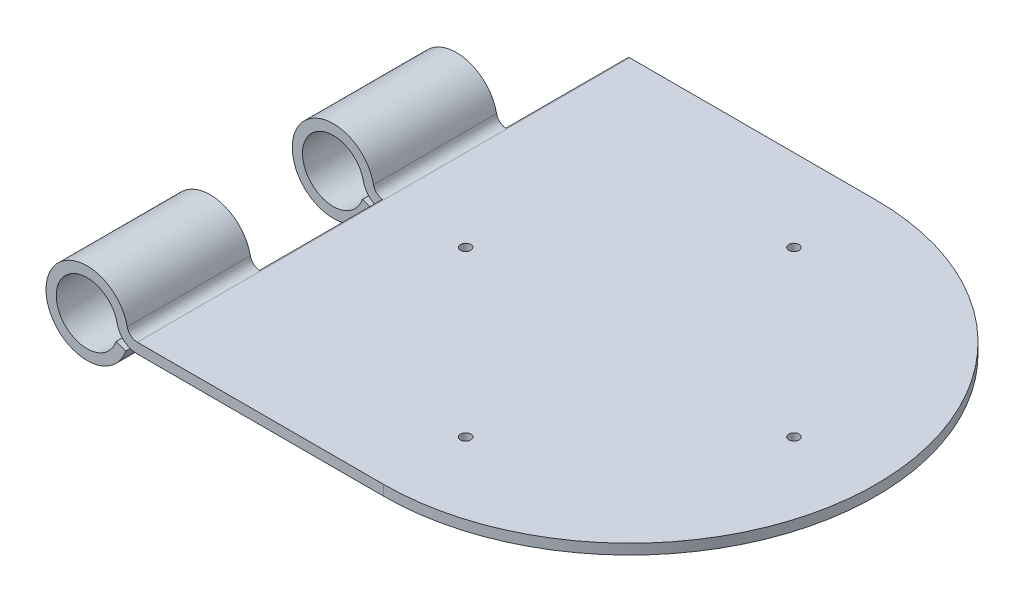
ISO-10303-21;
HEADER;
FILE_DESCRIPTION(('STEP AP214'),'2;1');
FILE_NAME('part.step','',(''),(''),'','','');
FILE_SCHEMA(('AUTOMOTIVE_DESIGN { 1 0 10303 214 1 1 1 1 }'));
ENDSEC;
DATA;
#1=APPLICATION_CONTEXT('core data for automotive mechanical design processes');
#2=APPLICATION_PROTOCOL_DEFINITION('international standard','automotive_design',2000,#1);
#3=PRODUCT_CONTEXT('',#1,'mechanical');
#4=PRODUCT('Part','Part','',(#3));
#5=PRODUCT_RELATED_PRODUCT_CATEGORY('part','',(#4));
#6=PRODUCT_DEFINITION_FORMATION('','',#4);
#7=PRODUCT_DEFINITION_CONTEXT('part definition',#1,'design');
#8=PRODUCT_DEFINITION('design','',#6,#7);
#9=PRODUCT_DEFINITION_SHAPE('','',#8);
#10=(LENGTH_UNIT() NAMED_UNIT(*) SI_UNIT(.MILLI.,.METRE.));
#11=(NAMED_UNIT(*) PLANE_ANGLE_UNIT() SI_UNIT($,.RADIAN.));
#12=(NAMED_UNIT(*) SI_UNIT($,.STERADIAN.) SOLID_ANGLE_UNIT());
#13=UNCERTAINTY_MEASURE_WITH_UNIT(LENGTH_MEASURE(1.E-05),#10,'distance_accuracy_value','');
#14=(GEOMETRIC_REPRESENTATION_CONTEXT(3) GLOBAL_UNCERTAINTY_ASSIGNED_CONTEXT((#13)) GLOBAL_UNIT_ASSIGNED_CONTEXT((#10,
#11,#12)) REPRESENTATION_CONTEXT('',''));
#15=CARTESIAN_POINT('',(0.,0.,0.));
#16=DIRECTION('',(0.,0.,1.));
#17=DIRECTION('',(1.,0.,0.));
#18=AXIS2_PLACEMENT_3D('',#15,#16,#17);
#19=CARTESIAN_POINT('',(0.,-1.5875,76.2));
#20=DIRECTION('',(0.,1.,0.));
#21=DIRECTION('',(0.,0.,1.));
#22=AXIS2_PLACEMENT_3D('',#19,#20,#21);
#23=PLANE('',#22);
#24=CARTESIAN_POINT('',(71.2771299333366,-1.5875,38.1));
#25=DIRECTION('',(0.,-1.,0.));
#26=DIRECTION('',(0.,0.,-1.));
#27=AXIS2_PLACEMENT_3D('',#24,#25,#26);
#28=CIRCLE('',#27,0.793749999999993);
#29=CARTESIAN_POINT('',(71.2771299333366,-1.5875,37.30625));
#30=VERTEX_POINT('',#29);
#31=EDGE_CURVE('E333',#30,#30,#28,.F.);
#32=ORIENTED_EDGE('',*,*,#31,.T.);
#33=EDGE_LOOP('',(#32));
#34=FACE_BOUND('',#33,.T.);
#35=CARTESIAN_POINT('',(45.8771299333366,-1.5875,63.5));
#36=DIRECTION('',(0.,-1.,0.));
#37=DIRECTION('',(0.,0.,-1.));
#38=AXIS2_PLACEMENT_3D('',#35,#36,#37);
#39=CIRCLE('',#38,0.793749999999993);
#40=CARTESIAN_POINT('',(45.8771299333366,-1.5875,62.70625));
#41=VERTEX_POINT('',#40);
#42=EDGE_CURVE('E327',#41,#41,#39,.F.);
#43=ORIENTED_EDGE('',*,*,#42,.T.);
#44=EDGE_LOOP('',(#43));
#45=FACE_BOUND('',#44,.T.);
#46=CARTESIAN_POINT('',(45.8771299333366,-1.5875,38.1));
#47=DIRECTION('',(0.,-1.,0.));
#48=DIRECTION('',(0.,0.,-1.));
#49=AXIS2_PLACEMENT_3D('',#46,#47,#48);
#50=CIRCLE('',#49,38.1);
#51=CARTESIAN_POINT('',(45.8771299333366,-1.5875,76.2));
#52=VERTEX_POINT('',#51);
#53=CARTESIAN_POINT('',(45.8771299333366,-1.5875,0.));
#54=VERTEX_POINT('',#53);
#55=EDGE_CURVE('E223',#52,#54,#50,.F.);
#56=ORIENTED_EDGE('',*,*,#55,.F.);
#57=DIRECTION('',(1.,0.,0.));
#58=VECTOR('',#57,1.);
#59=CARTESIAN_POINT('',(0.,-1.5875,76.2));
#60=LINE('',#59,#58);
#61=CARTESIAN_POINT('',(7.77712993333659,-1.5875,76.2));
#62=VERTEX_POINT('',#61);
#63=EDGE_CURVE('E227',#62,#52,#60,.T.);
#64=ORIENTED_EDGE('',*,*,#63,.F.);
#65=DIRECTION('',(0.,0.,-1.));
#66=VECTOR('',#65,1.);
#67=CARTESIAN_POINT('',(7.77712993333659,-1.5875,76.2));
#68=LINE('',#67,#66);
#69=CARTESIAN_POINT('',(7.77712993333659,-1.5875,0.));
#70=VERTEX_POINT('',#69);
#71=EDGE_CURVE('E303',#62,#70,#68,.T.);
#72=ORIENTED_EDGE('',*,*,#71,.T.);
#73=DIRECTION('',(1.,0.,0.));
#74=VECTOR('',#73,1.);
#75=CARTESIAN_POINT('',(0.,-1.5875,0.));
#76=LINE('',#75,#74);
#77=EDGE_CURVE('E230',#70,#54,#76,.T.);
#78=ORIENTED_EDGE('',*,*,#77,.T.);
#79=EDGE_LOOP('',(#56,#64,#72,#78));
#80=FACE_BOUND('',#79,.T.);
#81=CARTESIAN_POINT('',(20.4771299333366,-1.5875,38.1));
#82=DIRECTION('',(0.,-1.,0.));
#83=DIRECTION('',(0.,0.,-1.));
#84=AXIS2_PLACEMENT_3D('',#81,#82,#83);
#85=CIRCLE('',#84,0.793749999999999);
#86=CARTESIAN_POINT('',(20.4771299333366,-1.5875,37.30625));
#87=VERTEX_POINT('',#86);
#88=EDGE_CURVE('E330',#87,#87,#85,.F.);
#89=ORIENTED_EDGE('',*,*,#88,.T.);
#90=EDGE_LOOP('',(#89));
#91=FACE_BOUND('',#90,.T.);
#92=CARTESIAN_POINT('',(45.8771299333366,-1.5875,12.7));
#93=DIRECTION('',(0.,-1.,0.));
#94=DIRECTION('',(0.,0.,-1.));
#95=AXIS2_PLACEMENT_3D('',#92,#93,#94);
#96=CIRCLE('',#95,0.79375);
#97=CARTESIAN_POINT('',(45.8771299333366,-1.5875,11.90625));
#98=VERTEX_POINT('',#97);
#99=EDGE_CURVE('E344',#98,#98,#96,.F.);
#100=ORIENTED_EDGE('',*,*,#99,.T.);
#101=EDGE_LOOP('',(#100));
#102=FACE_BOUND('',#101,.T.);
#103=ADVANCED_FACE('F89',(#34,#45,#80,#91,#102),#23,.F.);
#104=CARTESIAN_POINT('',(0.,0.,76.2));
#105=DIRECTION('',(0.,1.,0.));
#106=DIRECTION('',(0.,0.,1.));
#107=AXIS2_PLACEMENT_3D('',#104,#105,#106);
#108=PLANE('',#107);
#109=CARTESIAN_POINT('',(71.2771299333366,0.,38.1));
#110=DIRECTION('',(0.,1.,0.));
#111=DIRECTION('',(0.,0.,1.));
#112=AXIS2_PLACEMENT_3D('',#109,#110,#111);
#113=CIRCLE('',#112,0.793749999999993);
#114=CARTESIAN_POINT('',(71.2771299333366,0.,38.89375));
#115=VERTEX_POINT('',#114);
#116=EDGE_CURVE('E331',#115,#115,#113,.F.);
#117=ORIENTED_EDGE('',*,*,#116,.T.);
#118=EDGE_LOOP('',(#117));
#119=FACE_BOUND('',#118,.T.);
#120=CARTESIAN_POINT('',(45.8771299333366,0.,63.5));
#121=DIRECTION('',(0.,1.,0.));
#122=DIRECTION('',(0.,0.,1.));
#123=AXIS2_PLACEMENT_3D('',#120,#121,#122);
#124=CIRCLE('',#123,0.793749999999993);
#125=CARTESIAN_POINT('',(45.8771299333366,0.,64.29375));
#126=VERTEX_POINT('',#125);
#127=EDGE_CURVE('E232',#126,#126,#124,.F.);
#128=ORIENTED_EDGE('',*,*,#127,.T.);
#129=EDGE_LOOP('',(#128));
#130=FACE_BOUND('',#129,.T.);
#131=DIRECTION('',(1.,0.,0.));
#132=VECTOR('',#131,1.);
#133=CARTESIAN_POINT('',(0.,0.,76.2));
#134=LINE('',#133,#132);
#135=CARTESIAN_POINT('',(7.77712993333659,0.,76.2));
#136=VERTEX_POINT('',#135);
#137=CARTESIAN_POINT('',(45.8771299333366,0.,76.2));
#138=VERTEX_POINT('',#137);
#139=EDGE_CURVE('E243',#136,#138,#134,.T.);
#140=ORIENTED_EDGE('',*,*,#139,.T.);
#141=CARTESIAN_POINT('',(45.8771299333366,0.,38.1));
#142=DIRECTION('',(0.,1.,0.));
#143=DIRECTION('',(0.,0.,1.));
#144=AXIS2_PLACEMENT_3D('',#141,#142,#143);
#145=CIRCLE('',#144,38.1);
#146=CARTESIAN_POINT('',(45.8771299333366,0.,0.));
#147=VERTEX_POINT('',#146);
#148=EDGE_CURVE('E99',#147,#138,#145,.F.);
#149=ORIENTED_EDGE('',*,*,#148,.F.);
#150=DIRECTION('',(1.,0.,0.));
#151=VECTOR('',#150,1.);
#152=CARTESIAN_POINT('',(0.,0.,0.));
#153=LINE('',#152,#151);
#154=CARTESIAN_POINT('',(7.77712993333659,0.,0.));
#155=VERTEX_POINT('',#154);
#156=EDGE_CURVE('E275',#155,#147,#153,.T.);
#157=ORIENTED_EDGE('',*,*,#156,.F.);
#158=DIRECTION('',(0.,0.,-1.));
#159=VECTOR('',#158,1.);
#160=CARTESIAN_POINT('',(7.77712993333659,0.,76.2));
#161=LINE('',#160,#159);
#162=EDGE_CURVE('E299',#136,#155,#161,.T.);
#163=ORIENTED_EDGE('',*,*,#162,.F.);
#164=EDGE_LOOP('',(#140,#149,#157,#163));
#165=FACE_BOUND('',#164,.T.);
#166=CARTESIAN_POINT('',(20.4771299333366,0.,38.1));
#167=DIRECTION('',(0.,1.,0.));
#168=DIRECTION('',(0.,0.,1.));
#169=AXIS2_PLACEMENT_3D('',#166,#167,#168);
#170=CIRCLE('',#169,0.793749999999999);
#171=CARTESIAN_POINT('',(20.4771299333366,0.,38.89375));
#172=VERTEX_POINT('',#171);
#173=EDGE_CURVE('E328',#172,#172,#170,.F.);
#174=ORIENTED_EDGE('',*,*,#173,.T.);
#175=EDGE_LOOP('',(#174));
#176=FACE_BOUND('',#175,.T.);
#177=CARTESIAN_POINT('',(45.8771299333366,0.,12.7));
#178=DIRECTION('',(0.,1.,0.));
#179=DIRECTION('',(0.,0.,1.));
#180=AXIS2_PLACEMENT_3D('',#177,#178,#179);
#181=CIRCLE('',#180,0.79375);
#182=CARTESIAN_POINT('',(45.8771299333366,0.,13.49375));
#183=VERTEX_POINT('',#182);
#184=EDGE_CURVE('E93',#183,#183,#181,.F.);
#185=ORIENTED_EDGE('',*,*,#184,.T.);
#186=EDGE_LOOP('',(#185));
#187=FACE_BOUND('',#186,.T.);
#188=ADVANCED_FACE('F427',(#119,#130,#165,#176,#187),#108,.T.);
#189=CARTESIAN_POINT('',(0.,0.,76.2));
#190=DIRECTION('',(0.,0.,1.));
#191=DIRECTION('',(1.,0.,0.));
#192=AXIS2_PLACEMENT_3D('',#189,#190,#191);
#193=PLANE('',#192);
#194=ORIENTED_EDGE('',*,*,#63,.T.);
#195=DIRECTION('',(0.,-1.,0.));
#196=VECTOR('',#195,1.);
#197=CARTESIAN_POINT('',(45.8771299333366,6.35,76.2));
#198=LINE('',#197,#196);
#199=EDGE_CURVE('E12',#52,#138,#198,.F.);
#200=ORIENTED_EDGE('',*,*,#199,.T.);
#201=ORIENTED_EDGE('',*,*,#139,.F.);
#202=CARTESIAN_POINT('',(7.77712993333659,1.5875,76.2));
#203=DIRECTION('',(0.,0.,1.));
#204=DIRECTION('',(1.,0.,0.));
#205=AXIS2_PLACEMENT_3D('',#202,#203,#204);
#206=CIRCLE('',#205,1.5875);
#207=CARTESIAN_POINT('',(6.22170394666927,1.27,76.2));
#208=VERTEX_POINT('',#207);
#209=EDGE_CURVE('E247',#208,#136,#206,.T.);
#210=ORIENTED_EDGE('',*,*,#209,.F.);
#211=CARTESIAN_POINT('',(0.,0.,76.2));
#212=DIRECTION('',(0.,0.,1.));
#213=DIRECTION('',(1.,0.,0.));
#214=AXIS2_PLACEMENT_3D('',#211,#212,#213);
#215=CIRCLE('',#214,6.35);
#216=CARTESIAN_POINT('',(6.00667083182451,-2.05971005680622,76.2));
#217=VERTEX_POINT('',#216);
#218=EDGE_CURVE('E257',#208,#217,#215,.T.);
#219=ORIENTED_EDGE('',*,*,#218,.T.);
#220=DIRECTION('',(-0.945932414460552,0.324363788473421,0.));
#221=VECTOR('',#220,1.);
#222=CARTESIAN_POINT('',(0.,0.,76.2));
#223=LINE('',#222,#221);
#224=CARTESIAN_POINT('',(4.50500312386838,-1.54478254260467,76.2));
#225=VERTEX_POINT('',#224);
#226=EDGE_CURVE('E260',#217,#225,#223,.T.);
#227=ORIENTED_EDGE('',*,*,#226,.T.);
#228=CARTESIAN_POINT('',(0.,0.,76.2));
#229=DIRECTION('',(0.,0.,1.));
#230=DIRECTION('',(1.,0.,0.));
#231=AXIS2_PLACEMENT_3D('',#228,#229,#230);
#232=CIRCLE('',#231,4.7625);
#233=CARTESIAN_POINT('',(4.66627796000195,0.9525,76.2));
#234=VERTEX_POINT('',#233);
#235=EDGE_CURVE('E263',#234,#225,#232,.T.);
#236=ORIENTED_EDGE('',*,*,#235,.F.);
#237=CARTESIAN_POINT('',(7.77712993333659,1.5875,76.2));
#238=DIRECTION('',(0.,0.,1.));
#239=DIRECTION('',(1.,0.,0.));
#240=AXIS2_PLACEMENT_3D('',#237,#238,#239);
#241=CIRCLE('',#240,3.175);
#242=EDGE_CURVE('E241',#62,#234,#241,.F.);
#243=ORIENTED_EDGE('',*,*,#242,.F.);
#244=EDGE_LOOP('',(#194,#200,#201,#210,#219,#227,#236,#243));
#245=FACE_BOUND('',#244,.T.);
#246=ADVANCED_FACE('F238',(#245),#193,.T.);
#247=CARTESIAN_POINT('',(0.,0.,0.));
#248=DIRECTION('',(0.,0.,1.));
#249=DIRECTION('',(1.,0.,0.));
#250=AXIS2_PLACEMENT_3D('',#247,#248,#249);
#251=PLANE('',#250);
#252=DIRECTION('',(0.,-1.,0.));
#253=VECTOR('',#252,1.);
#254=CARTESIAN_POINT('',(45.8771299333366,6.35,0.));
#255=LINE('',#254,#253);
#256=EDGE_CURVE('E110',#147,#54,#255,.T.);
#257=ORIENTED_EDGE('',*,*,#256,.T.);
#258=ORIENTED_EDGE('',*,*,#77,.F.);
#259=CARTESIAN_POINT('',(7.77712993333659,1.5875,0.));
#260=DIRECTION('',(0.,0.,1.));
#261=DIRECTION('',(1.,0.,0.));
#262=AXIS2_PLACEMENT_3D('',#259,#260,#261);
#263=CIRCLE('',#262,3.175);
#264=CARTESIAN_POINT('',(7.62000000000001,-1.5836094563338,0.));
#265=VERTEX_POINT('',#264);
#266=EDGE_CURVE('E268',#70,#265,#263,.F.);
#267=ORIENTED_EDGE('',*,*,#266,.T.);
#268=DIRECTION('',(0.,-1.,0.));
#269=VECTOR('',#268,1.);
#270=CARTESIAN_POINT('',(7.62000000000001,0.,0.));
#271=LINE('',#270,#269);
#272=CARTESIAN_POINT('',(7.62000000000001,0.00779545988825996,0.));
#273=VERTEX_POINT('',#272);
#274=EDGE_CURVE('E306',#273,#265,#271,.T.);
#275=ORIENTED_EDGE('',*,*,#274,.F.);
#276=CARTESIAN_POINT('',(7.77712993333659,1.5875,0.));
#277=DIRECTION('',(0.,0.,1.));
#278=DIRECTION('',(1.,0.,0.));
#279=AXIS2_PLACEMENT_3D('',#276,#277,#278);
#280=CIRCLE('',#279,1.5875);
#281=EDGE_CURVE('E250',#273,#155,#280,.T.);
#282=ORIENTED_EDGE('',*,*,#281,.T.);
#283=ORIENTED_EDGE('',*,*,#156,.T.);
#284=EDGE_LOOP('',(#257,#258,#267,#275,#282,#283));
#285=FACE_BOUND('',#284,.T.);
#286=ADVANCED_FACE('F424',(#285),#251,.F.);
#287=CARTESIAN_POINT('',(7.77712993333659,1.5875,76.2));
#288=DIRECTION('',(0.,0.,-1.));
#289=DIRECTION('',(-1.,0.,0.));
#290=AXIS2_PLACEMENT_3D('',#287,#288,#289);
#291=CYLINDRICAL_SURFACE('',#290,3.175);
#292=DIRECTION('',(0.,0.,-1.));
#293=VECTOR('',#292,1.);
#294=CARTESIAN_POINT('',(4.66627796000195,0.9525,76.2));
#295=LINE('',#294,#293);
#296=CARTESIAN_POINT('',(4.66627796000195,0.9525,57.15));
#297=VERTEX_POINT('',#296);
#298=EDGE_CURVE('E280',#234,#297,#295,.T.);
#299=ORIENTED_EDGE('',*,*,#298,.T.);
#300=CARTESIAN_POINT('',(7.77712993333659,1.5875,57.15));
#301=DIRECTION('',(0.,0.,-1.));
#302=DIRECTION('',(-1.,0.,0.));
#303=AXIS2_PLACEMENT_3D('',#300,#301,#302);
#304=CIRCLE('',#303,3.175);
#305=CARTESIAN_POINT('',(7.62000000000002,-1.5836094563338,57.15));
#306=VERTEX_POINT('',#305);
#307=EDGE_CURVE('E372',#297,#306,#304,.F.);
#308=ORIENTED_EDGE('',*,*,#307,.T.);
#309=DIRECTION('',(0.,0.,-1.));
#310=VECTOR('',#309,1.);
#311=CARTESIAN_POINT('',(7.62000000000002,-1.5836094563338,76.2));
#312=LINE('',#311,#310);
#313=CARTESIAN_POINT('',(7.62000000000002,-1.5836094563338,38.1));
#314=VERTEX_POINT('',#313);
#315=EDGE_CURVE('E382',#306,#314,#312,.T.);
#316=ORIENTED_EDGE('',*,*,#315,.T.);
#317=CARTESIAN_POINT('',(7.77712993333659,1.5875,38.1));
#318=DIRECTION('',(0.,0.,1.));
#319=DIRECTION('',(1.,0.,0.));
#320=AXIS2_PLACEMENT_3D('',#317,#318,#319);
#321=CIRCLE('',#320,3.175);
#322=CARTESIAN_POINT('',(4.66627796000195,0.9525,38.1));
#323=VERTEX_POINT('',#322);
#324=EDGE_CURVE('E360',#314,#323,#321,.F.);
#325=ORIENTED_EDGE('',*,*,#324,.T.);
#326=CARTESIAN_POINT('',(4.66627796000195,0.9525,19.05));
#327=VERTEX_POINT('',#326);
#328=EDGE_CURVE('E267',#323,#327,#295,.T.);
#329=ORIENTED_EDGE('',*,*,#328,.T.);
#330=CARTESIAN_POINT('',(7.77712993333659,1.5875,19.05));
#331=DIRECTION('',(0.,0.,-1.));
#332=DIRECTION('',(-1.,0.,0.));
#333=AXIS2_PLACEMENT_3D('',#330,#331,#332);
#334=CIRCLE('',#333,3.175);
#335=CARTESIAN_POINT('',(7.62000000000001,-1.5836094563338,19.05));
#336=VERTEX_POINT('',#335);
#337=EDGE_CURVE('E400',#327,#336,#334,.F.);
#338=ORIENTED_EDGE('',*,*,#337,.T.);
#339=DIRECTION('',(0.,0.,-1.));
#340=VECTOR('',#339,1.);
#341=CARTESIAN_POINT('',(7.62000000000001,-1.5836094563338,76.2));
#342=LINE('',#341,#340);
#343=EDGE_CURVE('E393',#336,#265,#342,.T.);
#344=ORIENTED_EDGE('',*,*,#343,.T.);
#345=ORIENTED_EDGE('',*,*,#266,.F.);
#346=ORIENTED_EDGE('',*,*,#71,.F.);
#347=ORIENTED_EDGE('',*,*,#242,.T.);
#348=EDGE_LOOP('',(#299,#308,#316,#325,#329,#338,#344,#345,#346,#347));
#349=FACE_BOUND('',#348,.T.);
#350=ADVANCED_FACE('F91',(#349),#291,.T.);
#351=CARTESIAN_POINT('',(7.77712993333659,1.5875,76.2));
#352=DIRECTION('',(0.,0.,-1.));
#353=DIRECTION('',(-1.,0.,0.));
#354=AXIS2_PLACEMENT_3D('',#351,#352,#353);
#355=CYLINDRICAL_SURFACE('',#354,1.5875);
#356=DIRECTION('',(0.,0.,-1.));
#357=VECTOR('',#356,1.);
#358=CARTESIAN_POINT('',(7.62000000000002,0.00779545988825953,76.2));
#359=LINE('',#358,#357);
#360=CARTESIAN_POINT('',(7.62000000000002,0.00779545988825931,38.1));
#361=VERTEX_POINT('',#360);
#362=CARTESIAN_POINT('',(7.62000000000002,0.0077954598882591,57.15));
#363=VERTEX_POINT('',#362);
#364=EDGE_CURVE('E319',#361,#363,#359,.F.);
#365=ORIENTED_EDGE('',*,*,#364,.T.);
#366=CARTESIAN_POINT('',(7.77712993333659,1.5875,57.15));
#367=DIRECTION('',(0.,0.,-1.));
#368=DIRECTION('',(-1.,0.,0.));
#369=AXIS2_PLACEMENT_3D('',#366,#367,#368);
#370=CIRCLE('',#369,1.5875);
#371=CARTESIAN_POINT('',(6.22170394666927,1.27,57.15));
#372=VERTEX_POINT('',#371);
#373=EDGE_CURVE('E376',#363,#372,#370,.T.);
#374=ORIENTED_EDGE('',*,*,#373,.T.);
#375=DIRECTION('',(0.,0.,-1.));
#376=VECTOR('',#375,1.);
#377=CARTESIAN_POINT('',(6.22170394666927,1.27,76.2));
#378=LINE('',#377,#376);
#379=EDGE_CURVE('E295',#208,#372,#378,.T.);
#380=ORIENTED_EDGE('',*,*,#379,.F.);
#381=ORIENTED_EDGE('',*,*,#209,.T.);
#382=ORIENTED_EDGE('',*,*,#162,.T.);
#383=ORIENTED_EDGE('',*,*,#281,.F.);
#384=DIRECTION('',(0.,0.,-1.));
#385=VECTOR('',#384,1.);
#386=CARTESIAN_POINT('',(7.62000000000001,0.00779545988826018,76.2));
#387=LINE('',#386,#385);
#388=CARTESIAN_POINT('',(7.62000000000001,0.00779545988825996,19.05));
#389=VERTEX_POINT('',#388);
#390=EDGE_CURVE('E389',#273,#389,#387,.F.);
#391=ORIENTED_EDGE('',*,*,#390,.T.);
#392=CARTESIAN_POINT('',(7.77712993333659,1.5875,19.05));
#393=DIRECTION('',(0.,0.,-1.));
#394=DIRECTION('',(-1.,0.,0.));
#395=AXIS2_PLACEMENT_3D('',#392,#393,#394);
#396=CIRCLE('',#395,1.5875);
#397=CARTESIAN_POINT('',(6.22170394666927,1.27,19.05));
#398=VERTEX_POINT('',#397);
#399=EDGE_CURVE('E272',#389,#398,#396,.T.);
#400=ORIENTED_EDGE('',*,*,#399,.T.);
#401=CARTESIAN_POINT('',(6.22170394666927,1.27,38.1));
#402=VERTEX_POINT('',#401);
#403=EDGE_CURVE('E294',#402,#398,#378,.T.);
#404=ORIENTED_EDGE('',*,*,#403,.F.);
#405=CARTESIAN_POINT('',(7.77712993333659,1.5875,38.1));
#406=DIRECTION('',(0.,0.,1.));
#407=DIRECTION('',(1.,0.,0.));
#408=AXIS2_PLACEMENT_3D('',#405,#406,#407);
#409=CIRCLE('',#408,1.5875);
#410=EDGE_CURVE('E363',#402,#361,#409,.T.);
#411=ORIENTED_EDGE('',*,*,#410,.T.);
#412=EDGE_LOOP('',(#365,#374,#380,#381,#382,#383,#391,#400,#404,#411));
#413=FACE_BOUND('',#412,.T.);
#414=ADVANCED_FACE('F411',(#413),#355,.F.);
#415=CARTESIAN_POINT('',(0.,0.,76.2));
#416=DIRECTION('',(0.,0.,-1.));
#417=DIRECTION('',(-1.,0.,0.));
#418=AXIS2_PLACEMENT_3D('',#415,#416,#417);
#419=CYLINDRICAL_SURFACE('',#418,6.35);
#420=CARTESIAN_POINT('',(0.,0.,57.15));
#421=DIRECTION('',(0.,0.,-1.));
#422=DIRECTION('',(-1.,0.,0.));
#423=AXIS2_PLACEMENT_3D('',#420,#421,#422);
#424=CIRCLE('',#423,6.35);
#425=CARTESIAN_POINT('',(6.0066708318245,-2.05971005680622,57.15));
#426=VERTEX_POINT('',#425);
#427=EDGE_CURVE('E373',#426,#372,#424,.T.);
#428=ORIENTED_EDGE('',*,*,#427,.F.);
#429=DIRECTION('',(0.,0.,-1.));
#430=VECTOR('',#429,1.);
#431=CARTESIAN_POINT('',(6.00667083182451,-2.05971005680622,76.2));
#432=LINE('',#431,#430);
#433=EDGE_CURVE('E290',#217,#426,#432,.T.);
#434=ORIENTED_EDGE('',*,*,#433,.F.);
#435=ORIENTED_EDGE('',*,*,#218,.F.);
#436=ORIENTED_EDGE('',*,*,#379,.T.);
#437=EDGE_LOOP('',(#428,#434,#435,#436));
#438=FACE_BOUND('',#437,.T.);
#439=ADVANCED_FACE('F433',(#438),#419,.T.);
#440=CARTESIAN_POINT('',(6.0066708318245,-2.05971005680622,38.1));
#441=VERTEX_POINT('',#440);
#442=CARTESIAN_POINT('',(6.0066708318245,-2.05971005680622,19.05));
#443=VERTEX_POINT('',#442);
#444=EDGE_CURVE('E289',#441,#443,#432,.T.);
#445=ORIENTED_EDGE('',*,*,#444,.F.);
#446=CARTESIAN_POINT('',(0.,0.,38.1));
#447=DIRECTION('',(0.,0.,1.));
#448=DIRECTION('',(1.,0.,0.));
#449=AXIS2_PLACEMENT_3D('',#446,#447,#448);
#450=CIRCLE('',#449,6.35);
#451=EDGE_CURVE('E361',#402,#441,#450,.T.);
#452=ORIENTED_EDGE('',*,*,#451,.F.);
#453=ORIENTED_EDGE('',*,*,#403,.T.);
#454=CARTESIAN_POINT('',(0.,0.,19.05));
#455=DIRECTION('',(0.,0.,-1.));
#456=DIRECTION('',(-1.,0.,0.));
#457=AXIS2_PLACEMENT_3D('',#454,#455,#456);
#458=CIRCLE('',#457,6.35);
#459=EDGE_CURVE('E401',#443,#398,#458,.T.);
#460=ORIENTED_EDGE('',*,*,#459,.F.);
#461=EDGE_LOOP('',(#445,#452,#453,#460));
#462=FACE_BOUND('',#461,.T.);
#463=ADVANCED_FACE('F451',(#462),#419,.T.);
#464=CARTESIAN_POINT('',(0.,0.,76.2));
#465=DIRECTION('',(-0.324363788473421,-0.945932414460552,0.));
#466=DIRECTION('',(0.945932414460552,-0.324363788473421,0.));
#467=AXIS2_PLACEMENT_3D('',#464,#465,#466);
#468=PLANE('',#467);
#469=DIRECTION('',(0.945932414460552,-0.324363788473421,0.));
#470=VECTOR('',#469,1.);
#471=CARTESIAN_POINT('',(0.,0.,57.15));
#472=LINE('',#471,#470);
#473=CARTESIAN_POINT('',(4.50500312386838,-1.54478254260467,57.15));
#474=VERTEX_POINT('',#473);
#475=EDGE_CURVE('E368',#474,#426,#472,.T.);
#476=ORIENTED_EDGE('',*,*,#475,.F.);
#477=DIRECTION('',(0.,0.,-1.));
#478=VECTOR('',#477,1.);
#479=CARTESIAN_POINT('',(4.50500312386838,-1.54478254260467,76.2));
#480=LINE('',#479,#478);
#481=EDGE_CURVE('E285',#225,#474,#480,.T.);
#482=ORIENTED_EDGE('',*,*,#481,.F.);
#483=ORIENTED_EDGE('',*,*,#226,.F.);
#484=ORIENTED_EDGE('',*,*,#433,.T.);
#485=EDGE_LOOP('',(#476,#482,#483,#484));
#486=FACE_BOUND('',#485,.T.);
#487=ADVANCED_FACE('F438',(#486),#468,.F.);
#488=DIRECTION('',(-0.945932414460552,0.324363788473421,0.));
#489=VECTOR('',#488,1.);
#490=CARTESIAN_POINT('',(0.,0.,38.1));
#491=LINE('',#490,#489);
#492=CARTESIAN_POINT('',(4.50500312386838,-1.54478254260467,38.1));
#493=VERTEX_POINT('',#492);
#494=EDGE_CURVE('E118',#441,#493,#491,.T.);
#495=ORIENTED_EDGE('',*,*,#494,.F.);
#496=ORIENTED_EDGE('',*,*,#444,.T.);
#497=DIRECTION('',(0.945932414460552,-0.324363788473421,0.));
#498=VECTOR('',#497,1.);
#499=CARTESIAN_POINT('',(0.,0.,19.05));
#500=LINE('',#499,#498);
#501=CARTESIAN_POINT('',(4.50500312386838,-1.54478254260467,19.05));
#502=VERTEX_POINT('',#501);
#503=EDGE_CURVE('E397',#502,#443,#500,.T.);
#504=ORIENTED_EDGE('',*,*,#503,.F.);
#505=EDGE_CURVE('E284',#493,#502,#480,.T.);
#506=ORIENTED_EDGE('',*,*,#505,.F.);
#507=EDGE_LOOP('',(#495,#496,#504,#506));
#508=FACE_BOUND('',#507,.T.);
#509=ADVANCED_FACE('F454',(#508),#468,.F.);
#510=CARTESIAN_POINT('',(0.,0.,76.2));
#511=DIRECTION('',(0.,0.,-1.));
#512=DIRECTION('',(-1.,0.,0.));
#513=AXIS2_PLACEMENT_3D('',#510,#511,#512);
#514=CYLINDRICAL_SURFACE('',#513,4.7625);
#515=ORIENTED_EDGE('',*,*,#481,.T.);
#516=CARTESIAN_POINT('',(0.,0.,57.15));
#517=DIRECTION('',(0.,0.,-1.));
#518=DIRECTION('',(-1.,0.,0.));
#519=AXIS2_PLACEMENT_3D('',#516,#517,#518);
#520=CIRCLE('',#519,4.7625);
#521=EDGE_CURVE('E315',#474,#297,#520,.T.);
#522=ORIENTED_EDGE('',*,*,#521,.T.);
#523=ORIENTED_EDGE('',*,*,#298,.F.);
#524=ORIENTED_EDGE('',*,*,#235,.T.);
#525=EDGE_LOOP('',(#515,#522,#523,#524));
#526=FACE_BOUND('',#525,.T.);
#527=ADVANCED_FACE('F440',(#526),#514,.F.);
#528=ORIENTED_EDGE('',*,*,#328,.F.);
#529=CARTESIAN_POINT('',(0.,0.,38.1));
#530=DIRECTION('',(0.,0.,1.));
#531=DIRECTION('',(1.,0.,0.));
#532=AXIS2_PLACEMENT_3D('',#529,#530,#531);
#533=CIRCLE('',#532,4.7625);
#534=EDGE_CURVE('E313',#323,#493,#533,.T.);
#535=ORIENTED_EDGE('',*,*,#534,.T.);
#536=ORIENTED_EDGE('',*,*,#505,.T.);
#537=CARTESIAN_POINT('',(0.,0.,19.05));
#538=DIRECTION('',(0.,0.,-1.));
#539=DIRECTION('',(-1.,0.,0.));
#540=AXIS2_PLACEMENT_3D('',#537,#538,#539);
#541=CIRCLE('',#540,4.7625);
#542=EDGE_CURVE('E309',#502,#327,#541,.T.);
#543=ORIENTED_EDGE('',*,*,#542,.T.);
#544=EDGE_LOOP('',(#528,#535,#536,#543));
#545=FACE_BOUND('',#544,.T.);
#546=ADVANCED_FACE('F459',(#545),#514,.F.);
#547=CARTESIAN_POINT('',(7.62000000000001,6.35,19.05));
#548=DIRECTION('',(0.,0.,-1.));
#549=DIRECTION('',(-1.,0.,0.));
#550=AXIS2_PLACEMENT_3D('',#547,#548,#549);
#551=PLANE('',#550);
#552=DIRECTION('',(0.,-1.,0.));
#553=VECTOR('',#552,1.);
#554=CARTESIAN_POINT('',(7.62000000000001,6.35,19.05));
#555=LINE('',#554,#553);
#556=EDGE_CURVE('E386',#389,#336,#555,.T.);
#557=ORIENTED_EDGE('',*,*,#556,.T.);
#558=ORIENTED_EDGE('',*,*,#337,.F.);
#559=ORIENTED_EDGE('',*,*,#542,.F.);
#560=ORIENTED_EDGE('',*,*,#503,.T.);
#561=ORIENTED_EDGE('',*,*,#459,.T.);
#562=ORIENTED_EDGE('',*,*,#399,.F.);
#563=EDGE_LOOP('',(#557,#558,#559,#560,#561,#562));
#564=FACE_BOUND('',#563,.T.);
#565=ADVANCED_FACE('F415',(#564),#551,.T.);
#566=CARTESIAN_POINT('',(7.62000000000001,6.35,0.));
#567=DIRECTION('',(-1.,0.,0.));
#568=DIRECTION('',(0.,0.,1.));
#569=AXIS2_PLACEMENT_3D('',#566,#567,#568);
#570=PLANE('',#569);
#571=ORIENTED_EDGE('',*,*,#556,.F.);
#572=ORIENTED_EDGE('',*,*,#390,.F.);
#573=ORIENTED_EDGE('',*,*,#274,.T.);
#574=ORIENTED_EDGE('',*,*,#343,.F.);
#575=EDGE_LOOP('',(#571,#572,#573,#574));
#576=FACE_BOUND('',#575,.T.);
#577=ADVANCED_FACE('F419',(#576),#570,.T.);
#578=CARTESIAN_POINT('',(7.62000000000002,6.35,57.15));
#579=DIRECTION('',(0.,0.,-1.));
#580=DIRECTION('',(-1.,0.,0.));
#581=AXIS2_PLACEMENT_3D('',#578,#579,#580);
#582=PLANE('',#581);
#583=DIRECTION('',(0.,-1.,0.));
#584=VECTOR('',#583,1.);
#585=CARTESIAN_POINT('',(7.62000000000002,6.35,57.15));
#586=LINE('',#585,#584);
#587=EDGE_CURVE('E355',#363,#306,#586,.T.);
#588=ORIENTED_EDGE('',*,*,#587,.T.);
#589=ORIENTED_EDGE('',*,*,#307,.F.);
#590=ORIENTED_EDGE('',*,*,#521,.F.);
#591=ORIENTED_EDGE('',*,*,#475,.T.);
#592=ORIENTED_EDGE('',*,*,#427,.T.);
#593=ORIENTED_EDGE('',*,*,#373,.F.);
#594=EDGE_LOOP('',(#588,#589,#590,#591,#592,#593));
#595=FACE_BOUND('',#594,.T.);
#596=ADVANCED_FACE('F442',(#595),#582,.T.);
#597=CARTESIAN_POINT('',(7.62000000000002,6.35,38.1));
#598=DIRECTION('',(0.,0.,1.));
#599=DIRECTION('',(1.,0.,0.));
#600=AXIS2_PLACEMENT_3D('',#597,#598,#599);
#601=PLANE('',#600);
#602=ORIENTED_EDGE('',*,*,#451,.T.);
#603=ORIENTED_EDGE('',*,*,#494,.T.);
#604=ORIENTED_EDGE('',*,*,#534,.F.);
#605=ORIENTED_EDGE('',*,*,#324,.F.);
#606=DIRECTION('',(0.,-1.,0.));
#607=VECTOR('',#606,1.);
#608=CARTESIAN_POINT('',(7.62000000000002,6.35,38.1));
#609=LINE('',#608,#607);
#610=EDGE_CURVE('E352',#361,#314,#609,.T.);
#611=ORIENTED_EDGE('',*,*,#610,.F.);
#612=ORIENTED_EDGE('',*,*,#410,.F.);
#613=EDGE_LOOP('',(#602,#603,#604,#605,#611,#612));
#614=FACE_BOUND('',#613,.T.);
#615=ADVANCED_FACE('F448',(#614),#601,.T.);
#616=CARTESIAN_POINT('',(7.62000000000002,6.35,57.15));
#617=DIRECTION('',(-1.,0.,0.));
#618=DIRECTION('',(0.,0.,1.));
#619=AXIS2_PLACEMENT_3D('',#616,#617,#618);
#620=PLANE('',#619);
#621=ORIENTED_EDGE('',*,*,#587,.F.);
#622=ORIENTED_EDGE('',*,*,#364,.F.);
#623=ORIENTED_EDGE('',*,*,#610,.T.);
#624=ORIENTED_EDGE('',*,*,#315,.F.);
#625=EDGE_LOOP('',(#621,#622,#623,#624));
#626=FACE_BOUND('',#625,.T.);
#627=ADVANCED_FACE('F445',(#626),#620,.T.);
#628=CARTESIAN_POINT('',(45.8771299333366,6.35,38.1));
#629=DIRECTION('',(0.,-1.,0.));
#630=DIRECTION('',(0.,0.,-1.));
#631=AXIS2_PLACEMENT_3D('',#628,#629,#630);
#632=CYLINDRICAL_SURFACE('',#631,38.1);
#633=ORIENTED_EDGE('',*,*,#148,.T.);
#634=ORIENTED_EDGE('',*,*,#199,.F.);
#635=ORIENTED_EDGE('',*,*,#55,.T.);
#636=ORIENTED_EDGE('',*,*,#256,.F.);
#637=EDGE_LOOP('',(#633,#634,#635,#636));
#638=FACE_BOUND('',#637,.T.);
#639=ADVANCED_FACE('F234',(#638),#632,.T.);
#640=CARTESIAN_POINT('',(45.8771299333366,6.35,63.5));
#641=DIRECTION('',(0.,-1.,0.));
#642=DIRECTION('',(0.,0.,-1.));
#643=AXIS2_PLACEMENT_3D('',#640,#641,#642);
#644=CYLINDRICAL_SURFACE('',#643,0.793749999999993);
#645=ORIENTED_EDGE('',*,*,#127,.F.);
#646=EDGE_LOOP('',(#645));
#647=FACE_BOUND('',#646,.T.);
#648=ORIENTED_EDGE('',*,*,#42,.F.);
#649=EDGE_LOOP('',(#648));
#650=FACE_BOUND('',#649,.T.);
#651=ADVANCED_FACE('F522',(#647,#650),#644,.F.);
#652=CARTESIAN_POINT('',(20.4771299333366,6.35,38.1));
#653=DIRECTION('',(0.,-1.,0.));
#654=DIRECTION('',(0.,0.,-1.));
#655=AXIS2_PLACEMENT_3D('',#652,#653,#654);
#656=CYLINDRICAL_SURFACE('',#655,0.793749999999999);
#657=ORIENTED_EDGE('',*,*,#173,.F.);
#658=EDGE_LOOP('',(#657));
#659=FACE_BOUND('',#658,.T.);
#660=ORIENTED_EDGE('',*,*,#88,.F.);
#661=EDGE_LOOP('',(#660));
#662=FACE_BOUND('',#661,.T.);
#663=ADVANCED_FACE('F534',(#659,#662),#656,.F.);
#664=CARTESIAN_POINT('',(71.2771299333366,6.35,38.1));
#665=DIRECTION('',(0.,-1.,0.));
#666=DIRECTION('',(0.,0.,-1.));
#667=AXIS2_PLACEMENT_3D('',#664,#665,#666);
#668=CYLINDRICAL_SURFACE('',#667,0.793749999999993);
#669=ORIENTED_EDGE('',*,*,#116,.F.);
#670=EDGE_LOOP('',(#669));
#671=FACE_BOUND('',#670,.T.);
#672=ORIENTED_EDGE('',*,*,#31,.F.);
#673=EDGE_LOOP('',(#672));
#674=FACE_BOUND('',#673,.T.);
#675=ADVANCED_FACE('F542',(#671,#674),#668,.F.);
#676=CARTESIAN_POINT('',(45.8771299333366,6.35,12.7));
#677=DIRECTION('',(0.,-1.,0.));
#678=DIRECTION('',(0.,0.,-1.));
#679=AXIS2_PLACEMENT_3D('',#676,#677,#678);
#680=CYLINDRICAL_SURFACE('',#679,0.79375);
#681=ORIENTED_EDGE('',*,*,#184,.F.);
#682=EDGE_LOOP('',(#681));
#683=FACE_BOUND('',#682,.T.);
#684=ORIENTED_EDGE('',*,*,#99,.F.);
#685=EDGE_LOOP('',(#684));
#686=FACE_BOUND('',#685,.T.);
#687=ADVANCED_FACE('F550',(#683,#686),#680,.F.);
#688=CLOSED_SHELL('',(#103,#188,#246,#286,#350,#414,#439,#463,#487,#509,#527,#546,#565,#577,
#596,#615,#627,#639,#651,#663,#675,#687));
#689=MANIFOLD_SOLID_BREP('B2',#688);
#690=ADVANCED_BREP_SHAPE_REPRESENTATION('',(#18,#689),#14);
#691=SHAPE_DEFINITION_REPRESENTATION(#9,#690);
ENDSEC;
END-ISO-10303-21;
